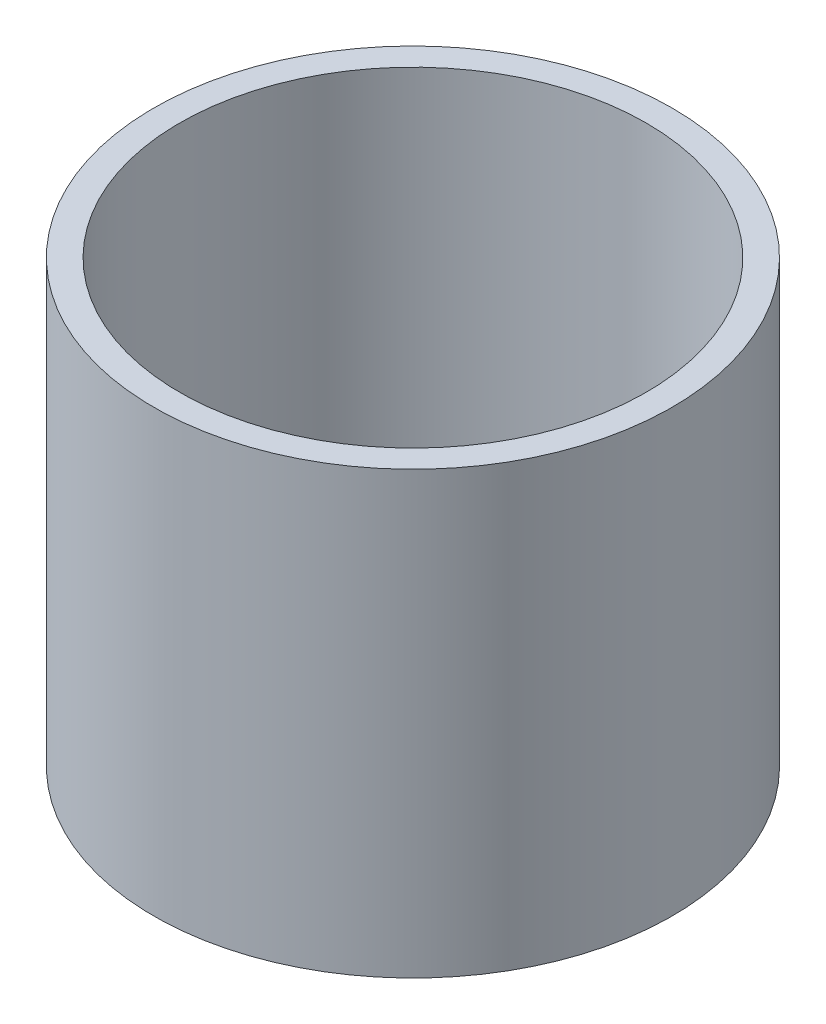
ISO-10303-21;
HEADER;
FILE_DESCRIPTION(('STEP AP214'),'2;1');
FILE_NAME('part.step','',(''),(''),'','','');
FILE_SCHEMA(('AUTOMOTIVE_DESIGN { 1 0 10303 214 1 1 1 1 }'));
ENDSEC;
DATA;
#1=APPLICATION_CONTEXT('core data for automotive mechanical design processes');
#2=APPLICATION_PROTOCOL_DEFINITION('international standard','automotive_design',2000,#1);
#3=PRODUCT_CONTEXT('',#1,'mechanical');
#4=PRODUCT('Part','Part','',(#3));
#5=PRODUCT_RELATED_PRODUCT_CATEGORY('part','',(#4));
#6=PRODUCT_DEFINITION_FORMATION('','',#4);
#7=PRODUCT_DEFINITION_CONTEXT('part definition',#1,'design');
#8=PRODUCT_DEFINITION('design','',#6,#7);
#9=PRODUCT_DEFINITION_SHAPE('','',#8);
#10=(LENGTH_UNIT() NAMED_UNIT(*) SI_UNIT(.MILLI.,.METRE.));
#11=(NAMED_UNIT(*) PLANE_ANGLE_UNIT() SI_UNIT($,.RADIAN.));
#12=(NAMED_UNIT(*) SI_UNIT($,.STERADIAN.) SOLID_ANGLE_UNIT());
#13=UNCERTAINTY_MEASURE_WITH_UNIT(LENGTH_MEASURE(1.E-05),#10,'distance_accuracy_value','');
#14=(GEOMETRIC_REPRESENTATION_CONTEXT(3) GLOBAL_UNCERTAINTY_ASSIGNED_CONTEXT((#13)) GLOBAL_UNIT_ASSIGNED_CONTEXT((#10,
#11,#12)) REPRESENTATION_CONTEXT('',''));
#15=CARTESIAN_POINT('',(0.,0.,0.));
#16=DIRECTION('',(0.,0.,1.));
#17=DIRECTION('',(1.,0.,0.));
#18=AXIS2_PLACEMENT_3D('',#15,#16,#17);
#19=CARTESIAN_POINT('',(0.,85.,0.));
#20=DIRECTION('',(0.,-1.,0.));
#21=DIRECTION('',(0.,0.,-1.));
#22=AXIS2_PLACEMENT_3D('',#19,#20,#21);
#23=CYLINDRICAL_SURFACE('',#22,45.);
#24=CARTESIAN_POINT('',(0.,0.,0.));
#25=DIRECTION('',(0.,-1.,0.));
#26=DIRECTION('',(0.,0.,-1.));
#27=AXIS2_PLACEMENT_3D('',#24,#25,#26);
#28=CIRCLE('',#27,45.);
#29=CARTESIAN_POINT('',(0.,0.,-45.));
#30=VERTEX_POINT('',#29);
#31=EDGE_CURVE('E26',#30,#30,#28,.T.);
#32=ORIENTED_EDGE('',*,*,#31,.T.);
#33=EDGE_LOOP('',(#32));
#34=FACE_BOUND('',#33,.T.);
#35=CARTESIAN_POINT('',(0.,85.,0.));
#36=DIRECTION('',(0.,-1.,0.));
#37=DIRECTION('',(0.,0.,-1.));
#38=AXIS2_PLACEMENT_3D('',#35,#36,#37);
#39=CIRCLE('',#38,45.);
#40=CARTESIAN_POINT('',(0.,85.,-45.));
#41=VERTEX_POINT('',#40);
#42=EDGE_CURVE('E17',#41,#41,#39,.T.);
#43=ORIENTED_EDGE('',*,*,#42,.F.);
#44=EDGE_LOOP('',(#43));
#45=FACE_BOUND('',#44,.T.);
#46=ADVANCED_FACE('F14',(#34,#45),#23,.F.);
#47=CARTESIAN_POINT('',(0.,85.,0.));
#48=DIRECTION('',(0.,1.,0.));
#49=DIRECTION('',(0.,0.,1.));
#50=AXIS2_PLACEMENT_3D('',#47,#48,#49);
#51=PLANE('',#50);
#52=ORIENTED_EDGE('',*,*,#42,.T.);
#53=EDGE_LOOP('',(#52));
#54=FACE_BOUND('',#53,.T.);
#55=CARTESIAN_POINT('',(0.,85.,0.));
#56=DIRECTION('',(0.,-1.,0.));
#57=DIRECTION('',(0.,0.,-1.));
#58=AXIS2_PLACEMENT_3D('',#55,#56,#57);
#59=CIRCLE('',#58,50.);
#60=CARTESIAN_POINT('',(0.,85.,-50.));
#61=VERTEX_POINT('',#60);
#62=EDGE_CURVE('E21',#61,#61,#59,.T.);
#63=ORIENTED_EDGE('',*,*,#62,.F.);
#64=EDGE_LOOP('',(#63));
#65=FACE_BOUND('',#64,.T.);
#66=ADVANCED_FACE('F34',(#54,#65),#51,.T.);
#67=CARTESIAN_POINT('',(0.,0.,0.));
#68=DIRECTION('',(0.,1.,0.));
#69=DIRECTION('',(0.,0.,1.));
#70=AXIS2_PLACEMENT_3D('',#67,#68,#69);
#71=PLANE('',#70);
#72=ORIENTED_EDGE('',*,*,#31,.F.);
#73=EDGE_LOOP('',(#72));
#74=FACE_BOUND('',#73,.T.);
#75=CARTESIAN_POINT('',(0.,0.,0.));
#76=DIRECTION('',(0.,-1.,0.));
#77=DIRECTION('',(0.,0.,-1.));
#78=AXIS2_PLACEMENT_3D('',#75,#76,#77);
#79=CIRCLE('',#78,50.);
#80=CARTESIAN_POINT('',(0.,0.,-50.));
#81=VERTEX_POINT('',#80);
#82=EDGE_CURVE('E10',#81,#81,#79,.F.);
#83=ORIENTED_EDGE('',*,*,#82,.F.);
#84=EDGE_LOOP('',(#83));
#85=FACE_BOUND('',#84,.T.);
#86=ADVANCED_FACE('F43',(#74,#85),#71,.F.);
#87=CARTESIAN_POINT('',(0.,85.,0.));
#88=DIRECTION('',(0.,-1.,0.));
#89=DIRECTION('',(0.,0.,-1.));
#90=AXIS2_PLACEMENT_3D('',#87,#88,#89);
#91=CYLINDRICAL_SURFACE('',#90,50.);
#92=ORIENTED_EDGE('',*,*,#82,.T.);
#93=EDGE_LOOP('',(#92));
#94=FACE_BOUND('',#93,.T.);
#95=ORIENTED_EDGE('',*,*,#62,.T.);
#96=EDGE_LOOP('',(#95));
#97=FACE_BOUND('',#96,.T.);
#98=ADVANCED_FACE('F44',(#94,#97),#91,.T.);
#99=CLOSED_SHELL('',(#46,#66,#86,#98));
#100=MANIFOLD_SOLID_BREP('B1',#99);
#101=ADVANCED_BREP_SHAPE_REPRESENTATION('',(#18,#100),#14);
#102=SHAPE_DEFINITION_REPRESENTATION(#9,#101);
ENDSEC;
END-ISO-10303-21;
